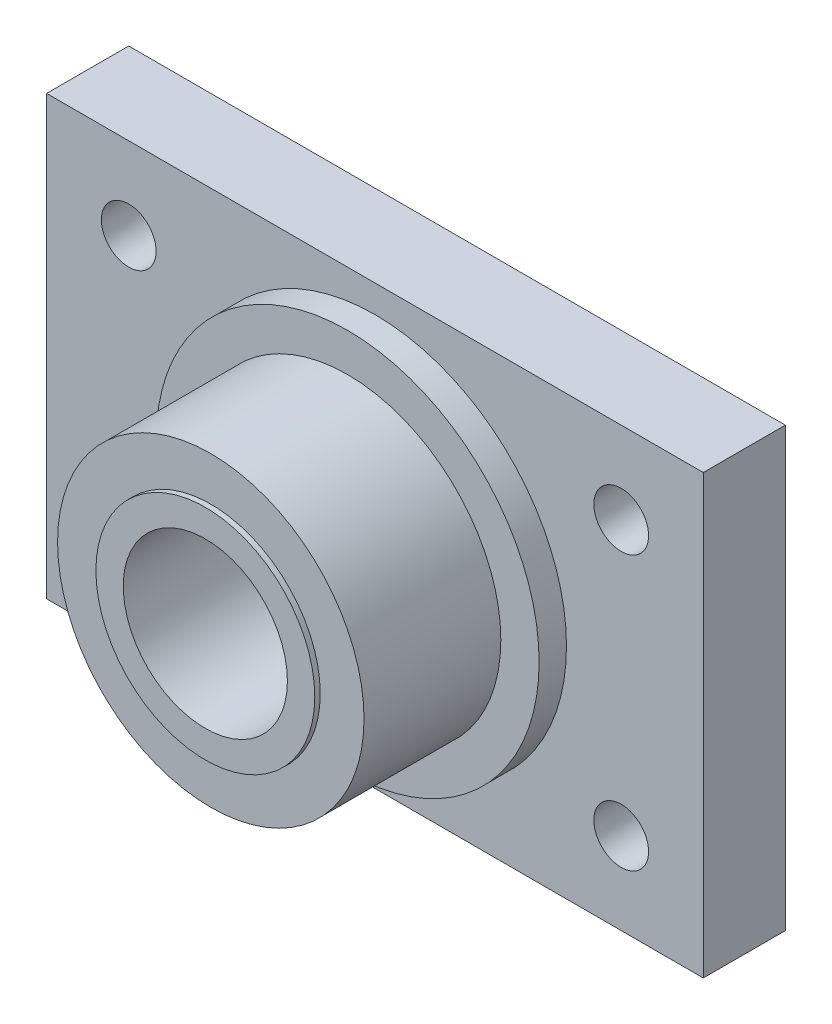
ISO-10303-21;
HEADER;
FILE_DESCRIPTION(('STEP AP214'),'2;1');
FILE_NAME('part.step','',(''),(''),'','','');
FILE_SCHEMA(('AUTOMOTIVE_DESIGN { 1 0 10303 214 1 1 1 1 }'));
ENDSEC;
DATA;
#1=APPLICATION_CONTEXT('core data for automotive mechanical design processes');
#2=APPLICATION_PROTOCOL_DEFINITION('international standard','automotive_design',2000,#1);
#3=PRODUCT_CONTEXT('',#1,'mechanical');
#4=PRODUCT('Part','Part','',(#3));
#5=PRODUCT_RELATED_PRODUCT_CATEGORY('part','',(#4));
#6=PRODUCT_DEFINITION_FORMATION('','',#4);
#7=PRODUCT_DEFINITION_CONTEXT('part definition',#1,'design');
#8=PRODUCT_DEFINITION('design','',#6,#7);
#9=PRODUCT_DEFINITION_SHAPE('','',#8);
#10=(LENGTH_UNIT() NAMED_UNIT(*) SI_UNIT(.MILLI.,.METRE.));
#11=(NAMED_UNIT(*) PLANE_ANGLE_UNIT() SI_UNIT($,.RADIAN.));
#12=(NAMED_UNIT(*) SI_UNIT($,.STERADIAN.) SOLID_ANGLE_UNIT());
#13=UNCERTAINTY_MEASURE_WITH_UNIT(LENGTH_MEASURE(1.E-05),#10,'distance_accuracy_value','');
#14=(GEOMETRIC_REPRESENTATION_CONTEXT(3) GLOBAL_UNCERTAINTY_ASSIGNED_CONTEXT((#13)) GLOBAL_UNIT_ASSIGNED_CONTEXT((#10,
#11,#12)) REPRESENTATION_CONTEXT('',''));
#15=CARTESIAN_POINT('',(0.,0.,0.));
#16=DIRECTION('',(0.,0.,1.));
#17=DIRECTION('',(1.,0.,0.));
#18=AXIS2_PLACEMENT_3D('',#15,#16,#17);
#19=CARTESIAN_POINT('',(0.,0.,15.));
#20=DIRECTION('',(0.,0.,1.));
#21=DIRECTION('',(1.,0.,0.));
#22=AXIS2_PLACEMENT_3D('',#19,#20,#21);
#23=PLANE('',#22);
#24=CARTESIAN_POINT('',(0.,0.,15.));
#25=DIRECTION('',(0.,0.,-1.));
#26=DIRECTION('',(1.,0.,0.));
#27=AXIS2_PLACEMENT_3D('',#24,#25,#26);
#28=CIRCLE('',#27,15.);
#29=CARTESIAN_POINT('',(15.,0.,15.));
#30=VERTEX_POINT('',#29);
#31=EDGE_CURVE('E25',#30,#30,#28,.T.);
#32=ORIENTED_EDGE('',*,*,#31,.F.);
#33=EDGE_LOOP('',(#32));
#34=FACE_BOUND('',#33,.T.);
#35=ADVANCED_FACE('F16',(#34),#23,.T.);
#36=CARTESIAN_POINT('',(0.,0.,0.));
#37=DIRECTION('',(0.,0.,-1.));
#38=DIRECTION('',(1.,0.,0.));
#39=AXIS2_PLACEMENT_3D('',#36,#37,#38);
#40=CYLINDRICAL_SURFACE('',#39,15.);
#41=ORIENTED_EDGE('',*,*,#31,.T.);
#42=DIRECTION('',(0.,0.,1.));
#43=VECTOR('',#42,1.);
#44=CARTESIAN_POINT('',(15.,0.,0.));
#45=LINE('',#44,#43);
#46=CARTESIAN_POINT('',(15.,0.,46.));
#47=VERTEX_POINT('',#46);
#48=EDGE_CURVE('E10',#30,#47,#45,.T.);
#49=ORIENTED_EDGE('',*,*,#48,.T.);
#50=CARTESIAN_POINT('',(0.,0.,46.));
#51=DIRECTION('',(0.,0.,-1.));
#52=DIRECTION('',(1.,0.,0.));
#53=AXIS2_PLACEMENT_3D('',#50,#51,#52);
#54=CIRCLE('',#53,15.);
#55=EDGE_CURVE('E19',#47,#47,#54,.T.);
#56=ORIENTED_EDGE('',*,*,#55,.F.);
#57=ORIENTED_EDGE('',*,*,#48,.F.);
#58=EDGE_LOOP('',(#41,#49,#56,#57));
#59=FACE_BOUND('',#58,.T.);
#60=ADVANCED_FACE('F274',(#59),#40,.F.);
#61=CARTESIAN_POINT('',(0.,0.,46.));
#62=DIRECTION('',(0.,0.,1.));
#63=DIRECTION('',(1.,0.,0.));
#64=AXIS2_PLACEMENT_3D('',#61,#62,#63);
#65=PLANE('',#64);
#66=ORIENTED_EDGE('',*,*,#55,.T.);
#67=EDGE_LOOP('',(#66));
#68=FACE_BOUND('',#67,.T.);
#69=CARTESIAN_POINT('',(0.,0.,46.));
#70=DIRECTION('',(0.,0.,1.));
#71=DIRECTION('',(1.,0.,0.));
#72=AXIS2_PLACEMENT_3D('',#69,#70,#71);
#73=CIRCLE('',#72,20.);
#74=CARTESIAN_POINT('',(20.,0.,46.));
#75=VERTEX_POINT('',#74);
#76=EDGE_CURVE('E228',#75,#75,#73,.T.);
#77=ORIENTED_EDGE('',*,*,#76,.T.);
#78=EDGE_LOOP('',(#77));
#79=FACE_BOUND('',#78,.T.);
#80=ADVANCED_FACE('F273',(#68,#79),#65,.T.);
#81=CARTESIAN_POINT('',(0.,0.,45.));
#82=DIRECTION('',(0.,0.,1.));
#83=DIRECTION('',(1.,0.,0.));
#84=AXIS2_PLACEMENT_3D('',#81,#82,#83);
#85=CYLINDRICAL_SURFACE('',#84,20.);
#86=CARTESIAN_POINT('',(0.,0.,45.));
#87=DIRECTION('',(0.,0.,1.));
#88=DIRECTION('',(1.,0.,0.));
#89=AXIS2_PLACEMENT_3D('',#86,#87,#88);
#90=CIRCLE('',#89,20.);
#91=CARTESIAN_POINT('',(20.,0.,45.));
#92=VERTEX_POINT('',#91);
#93=EDGE_CURVE('E229',#92,#92,#90,.T.);
#94=ORIENTED_EDGE('',*,*,#93,.T.);
#95=DIRECTION('',(0.,0.,1.));
#96=VECTOR('',#95,1.);
#97=CARTESIAN_POINT('',(20.,0.,45.));
#98=LINE('',#97,#96);
#99=EDGE_CURVE('E224',#92,#75,#98,.T.);
#100=ORIENTED_EDGE('',*,*,#99,.T.);
#101=ORIENTED_EDGE('',*,*,#76,.F.);
#102=ORIENTED_EDGE('',*,*,#99,.F.);
#103=EDGE_LOOP('',(#94,#100,#101,#102));
#104=FACE_BOUND('',#103,.T.);
#105=ADVANCED_FACE('F283',(#104),#85,.T.);
#106=CARTESIAN_POINT('',(0.,0.,45.));
#107=DIRECTION('',(0.,0.,1.));
#108=DIRECTION('',(1.,0.,0.));
#109=AXIS2_PLACEMENT_3D('',#106,#107,#108);
#110=PLANE('',#109);
#111=ORIENTED_EDGE('',*,*,#93,.F.);
#112=EDGE_LOOP('',(#111));
#113=FACE_BOUND('',#112,.T.);
#114=CARTESIAN_POINT('',(0.,0.,45.));
#115=DIRECTION('',(0.,0.,1.));
#116=DIRECTION('',(1.,0.,0.));
#117=AXIS2_PLACEMENT_3D('',#114,#115,#116);
#118=CIRCLE('',#117,28.);
#119=CARTESIAN_POINT('',(28.,0.,45.));
#120=VERTEX_POINT('',#119);
#121=EDGE_CURVE('E233',#120,#120,#118,.T.);
#122=ORIENTED_EDGE('',*,*,#121,.T.);
#123=EDGE_LOOP('',(#122));
#124=FACE_BOUND('',#123,.T.);
#125=ADVANCED_FACE('F309',(#113,#124),#110,.T.);
#126=CARTESIAN_POINT('',(0.,0.,20.));
#127=DIRECTION('',(0.,0.,1.));
#128=DIRECTION('',(1.,0.,0.));
#129=AXIS2_PLACEMENT_3D('',#126,#127,#128);
#130=CYLINDRICAL_SURFACE('',#129,28.);
#131=CARTESIAN_POINT('',(0.,0.,20.));
#132=DIRECTION('',(0.,0.,1.));
#133=DIRECTION('',(1.,0.,0.));
#134=AXIS2_PLACEMENT_3D('',#131,#132,#133);
#135=CIRCLE('',#134,28.);
#136=CARTESIAN_POINT('',(28.,0.,20.));
#137=VERTEX_POINT('',#136);
#138=EDGE_CURVE('E237',#137,#137,#135,.T.);
#139=ORIENTED_EDGE('',*,*,#138,.T.);
#140=DIRECTION('',(0.,0.,1.));
#141=VECTOR('',#140,1.);
#142=CARTESIAN_POINT('',(28.,0.,20.));
#143=LINE('',#142,#141);
#144=EDGE_CURVE('E236',#137,#120,#143,.T.);
#145=ORIENTED_EDGE('',*,*,#144,.T.);
#146=ORIENTED_EDGE('',*,*,#121,.F.);
#147=ORIENTED_EDGE('',*,*,#144,.F.);
#148=EDGE_LOOP('',(#139,#145,#146,#147));
#149=FACE_BOUND('',#148,.T.);
#150=ADVANCED_FACE('F319',(#149),#130,.T.);
#151=CARTESIAN_POINT('',(0.,0.,20.));
#152=DIRECTION('',(0.,0.,1.));
#153=DIRECTION('',(1.,0.,0.));
#154=AXIS2_PLACEMENT_3D('',#151,#152,#153);
#155=PLANE('',#154);
#156=ORIENTED_EDGE('',*,*,#138,.F.);
#157=EDGE_LOOP('',(#156));
#158=FACE_BOUND('',#157,.T.);
#159=CARTESIAN_POINT('',(0.,0.,20.));
#160=DIRECTION('',(0.,0.,1.));
#161=DIRECTION('',(1.,0.,0.));
#162=AXIS2_PLACEMENT_3D('',#159,#160,#161);
#163=CIRCLE('',#162,35.);
#164=CARTESIAN_POINT('',(35.,0.,20.));
#165=VERTEX_POINT('',#164);
#166=EDGE_CURVE('E241',#165,#165,#163,.T.);
#167=ORIENTED_EDGE('',*,*,#166,.T.);
#168=EDGE_LOOP('',(#167));
#169=FACE_BOUND('',#168,.T.);
#170=ADVANCED_FACE('F315',(#158,#169),#155,.T.);
#171=CARTESIAN_POINT('',(0.,0.,0.));
#172=DIRECTION('',(0.,0.,1.));
#173=DIRECTION('',(1.,0.,0.));
#174=AXIS2_PLACEMENT_3D('',#171,#172,#173);
#175=CYLINDRICAL_SURFACE('',#174,35.);
#176=CARTESIAN_POINT('',(0.,0.,15.));
#177=DIRECTION('',(0.,0.,1.));
#178=DIRECTION('',(1.,0.,0.));
#179=AXIS2_PLACEMENT_3D('',#176,#177,#178);
#180=CIRCLE('',#179,35.);
#181=CARTESIAN_POINT('',(35.,0.,15.));
#182=VERTEX_POINT('',#181);
#183=EDGE_CURVE('E197',#182,#182,#180,.T.);
#184=ORIENTED_EDGE('',*,*,#183,.T.);
#185=DIRECTION('',(0.,0.,1.));
#186=VECTOR('',#185,1.);
#187=CARTESIAN_POINT('',(35.,0.,0.));
#188=LINE('',#187,#186);
#189=EDGE_CURVE('E254',#182,#165,#188,.T.);
#190=ORIENTED_EDGE('',*,*,#189,.T.);
#191=ORIENTED_EDGE('',*,*,#166,.F.);
#192=ORIENTED_EDGE('',*,*,#189,.F.);
#193=EDGE_LOOP('',(#184,#190,#191,#192));
#194=FACE_BOUND('',#193,.T.);
#195=ADVANCED_FACE('F318',(#194),#175,.T.);
#196=CARTESIAN_POINT('',(0.,0.,15.));
#197=DIRECTION('',(0.,0.,1.));
#198=DIRECTION('',(1.,0.,0.));
#199=AXIS2_PLACEMENT_3D('',#196,#197,#198);
#200=PLANE('',#199);
#201=CARTESIAN_POINT('',(45.,25.,15.));
#202=DIRECTION('',(0.,0.,-1.));
#203=DIRECTION('',(1.,0.,0.));
#204=AXIS2_PLACEMENT_3D('',#201,#202,#203);
#205=CIRCLE('',#204,5.);
#206=CARTESIAN_POINT('',(50.,25.,15.));
#207=VERTEX_POINT('',#206);
#208=EDGE_CURVE('E195',#207,#207,#205,.T.);
#209=ORIENTED_EDGE('',*,*,#208,.T.);
#210=EDGE_LOOP('',(#209));
#211=FACE_BOUND('',#210,.T.);
#212=ORIENTED_EDGE('',*,*,#183,.F.);
#213=EDGE_LOOP('',(#212));
#214=FACE_BOUND('',#213,.T.);
#215=CARTESIAN_POINT('',(-45.,25.,15.));
#216=DIRECTION('',(0.,0.,-1.));
#217=DIRECTION('',(1.,0.,0.));
#218=AXIS2_PLACEMENT_3D('',#215,#216,#217);
#219=CIRCLE('',#218,5.);
#220=CARTESIAN_POINT('',(-40.,25.,15.));
#221=VERTEX_POINT('',#220);
#222=EDGE_CURVE('E245',#221,#221,#219,.T.);
#223=ORIENTED_EDGE('',*,*,#222,.T.);
#224=EDGE_LOOP('',(#223));
#225=FACE_BOUND('',#224,.T.);
#226=CARTESIAN_POINT('',(45.,-25.,15.));
#227=DIRECTION('',(0.,0.,-1.));
#228=DIRECTION('',(1.,0.,0.));
#229=AXIS2_PLACEMENT_3D('',#226,#227,#228);
#230=CIRCLE('',#229,5.);
#231=CARTESIAN_POINT('',(50.,-25.,15.));
#232=VERTEX_POINT('',#231);
#233=EDGE_CURVE('E214',#232,#232,#230,.T.);
#234=ORIENTED_EDGE('',*,*,#233,.T.);
#235=EDGE_LOOP('',(#234));
#236=FACE_BOUND('',#235,.T.);
#237=CARTESIAN_POINT('',(-45.,-25.,15.));
#238=DIRECTION('',(0.,0.,-1.));
#239=DIRECTION('',(1.,0.,0.));
#240=AXIS2_PLACEMENT_3D('',#237,#238,#239);
#241=CIRCLE('',#240,5.);
#242=CARTESIAN_POINT('',(-40.,-25.,15.));
#243=VERTEX_POINT('',#242);
#244=EDGE_CURVE('E215',#243,#243,#241,.T.);
#245=ORIENTED_EDGE('',*,*,#244,.T.);
#246=EDGE_LOOP('',(#245));
#247=FACE_BOUND('',#246,.T.);
#248=DIRECTION('',(1.,0.,0.));
#249=VECTOR('',#248,1.);
#250=CARTESIAN_POINT('',(-60.,-40.,15.));
#251=LINE('',#250,#249);
#252=CARTESIAN_POINT('',(-60.,-40.,15.));
#253=VERTEX_POINT('',#252);
#254=CARTESIAN_POINT('',(60.,-40.,15.));
#255=VERTEX_POINT('',#254);
#256=EDGE_CURVE('E140',#253,#255,#251,.T.);
#257=ORIENTED_EDGE('',*,*,#256,.T.);
#258=DIRECTION('',(0.,1.,0.));
#259=VECTOR('',#258,1.);
#260=CARTESIAN_POINT('',(60.,-40.,15.));
#261=LINE('',#260,#259);
#262=CARTESIAN_POINT('',(60.,40.,15.));
#263=VERTEX_POINT('',#262);
#264=EDGE_CURVE('E205',#255,#263,#261,.T.);
#265=ORIENTED_EDGE('',*,*,#264,.T.);
#266=DIRECTION('',(-1.,0.,0.));
#267=VECTOR('',#266,1.);
#268=CARTESIAN_POINT('',(60.,40.,15.));
#269=LINE('',#268,#267);
#270=CARTESIAN_POINT('',(-60.,40.,15.));
#271=VERTEX_POINT('',#270);
#272=EDGE_CURVE('E208',#263,#271,#269,.T.);
#273=ORIENTED_EDGE('',*,*,#272,.T.);
#274=DIRECTION('',(0.,-1.,0.));
#275=VECTOR('',#274,1.);
#276=CARTESIAN_POINT('',(-60.,40.,15.));
#277=LINE('',#276,#275);
#278=EDGE_CURVE('E144',#271,#253,#277,.T.);
#279=ORIENTED_EDGE('',*,*,#278,.T.);
#280=EDGE_LOOP('',(#257,#265,#273,#279));
#281=FACE_BOUND('',#280,.T.);
#282=ADVANCED_FACE('F327',(#211,#214,#225,#236,#247,#281),#200,.T.);
#283=CARTESIAN_POINT('',(45.,25.,0.));
#284=DIRECTION('',(0.,0.,-1.));
#285=DIRECTION('',(1.,0.,0.));
#286=AXIS2_PLACEMENT_3D('',#283,#284,#285);
#287=CYLINDRICAL_SURFACE('',#286,5.);
#288=CARTESIAN_POINT('',(45.,25.,0.));
#289=DIRECTION('',(0.,0.,1.));
#290=DIRECTION('',(1.,0.,0.));
#291=AXIS2_PLACEMENT_3D('',#288,#289,#290);
#292=CIRCLE('',#291,5.);
#293=CARTESIAN_POINT('',(50.,25.,0.));
#294=VERTEX_POINT('',#293);
#295=EDGE_CURVE('E168',#294,#294,#292,.T.);
#296=ORIENTED_EDGE('',*,*,#295,.F.);
#297=DIRECTION('',(0.,0.,1.));
#298=VECTOR('',#297,1.);
#299=CARTESIAN_POINT('',(50.,25.,0.));
#300=LINE('',#299,#298);
#301=EDGE_CURVE('E198',#294,#207,#300,.T.);
#302=ORIENTED_EDGE('',*,*,#301,.T.);
#303=ORIENTED_EDGE('',*,*,#208,.F.);
#304=ORIENTED_EDGE('',*,*,#301,.F.);
#305=EDGE_LOOP('',(#296,#302,#303,#304));
#306=FACE_BOUND('',#305,.T.);
#307=ADVANCED_FACE('F323',(#306),#287,.F.);
#308=CARTESIAN_POINT('',(-45.,25.,0.));
#309=DIRECTION('',(0.,0.,-1.));
#310=DIRECTION('',(1.,0.,0.));
#311=AXIS2_PLACEMENT_3D('',#308,#309,#310);
#312=CYLINDRICAL_SURFACE('',#311,5.);
#313=CARTESIAN_POINT('',(-45.,25.,0.));
#314=DIRECTION('',(0.,0.,1.));
#315=DIRECTION('',(1.,0.,0.));
#316=AXIS2_PLACEMENT_3D('',#313,#314,#315);
#317=CIRCLE('',#316,5.);
#318=CARTESIAN_POINT('',(-40.,25.,0.));
#319=VERTEX_POINT('',#318);
#320=EDGE_CURVE('E171',#319,#319,#317,.T.);
#321=ORIENTED_EDGE('',*,*,#320,.F.);
#322=DIRECTION('',(0.,0.,1.));
#323=VECTOR('',#322,1.);
#324=CARTESIAN_POINT('',(-40.,25.,0.));
#325=LINE('',#324,#323);
#326=EDGE_CURVE('E232',#319,#221,#325,.T.);
#327=ORIENTED_EDGE('',*,*,#326,.T.);
#328=ORIENTED_EDGE('',*,*,#222,.F.);
#329=ORIENTED_EDGE('',*,*,#326,.F.);
#330=EDGE_LOOP('',(#321,#327,#328,#329));
#331=FACE_BOUND('',#330,.T.);
#332=ADVANCED_FACE('F313',(#331),#312,.F.);
#333=CARTESIAN_POINT('',(45.,-25.,0.));
#334=DIRECTION('',(0.,0.,-1.));
#335=DIRECTION('',(1.,0.,0.));
#336=AXIS2_PLACEMENT_3D('',#333,#334,#335);
#337=CYLINDRICAL_SURFACE('',#336,5.);
#338=CARTESIAN_POINT('',(45.,-25.,0.));
#339=DIRECTION('',(0.,0.,1.));
#340=DIRECTION('',(1.,0.,0.));
#341=AXIS2_PLACEMENT_3D('',#338,#339,#340);
#342=CIRCLE('',#341,5.);
#343=CARTESIAN_POINT('',(50.,-25.,0.));
#344=VERTEX_POINT('',#343);
#345=EDGE_CURVE('E176',#344,#344,#342,.T.);
#346=ORIENTED_EDGE('',*,*,#345,.F.);
#347=DIRECTION('',(0.,0.,1.));
#348=VECTOR('',#347,1.);
#349=CARTESIAN_POINT('',(50.,-25.,0.));
#350=LINE('',#349,#348);
#351=EDGE_CURVE('E210',#344,#232,#350,.T.);
#352=ORIENTED_EDGE('',*,*,#351,.T.);
#353=ORIENTED_EDGE('',*,*,#233,.F.);
#354=ORIENTED_EDGE('',*,*,#351,.F.);
#355=EDGE_LOOP('',(#346,#352,#353,#354));
#356=FACE_BOUND('',#355,.T.);
#357=ADVANCED_FACE('F305',(#356),#337,.F.);
#358=CARTESIAN_POINT('',(-45.,-25.,0.));
#359=DIRECTION('',(0.,0.,-1.));
#360=DIRECTION('',(1.,0.,0.));
#361=AXIS2_PLACEMENT_3D('',#358,#359,#360);
#362=CYLINDRICAL_SURFACE('',#361,5.);
#363=CARTESIAN_POINT('',(-45.,-25.,0.));
#364=DIRECTION('',(0.,0.,1.));
#365=DIRECTION('',(1.,0.,0.));
#366=AXIS2_PLACEMENT_3D('',#363,#364,#365);
#367=CIRCLE('',#366,5.);
#368=CARTESIAN_POINT('',(-40.,-25.,0.));
#369=VERTEX_POINT('',#368);
#370=EDGE_CURVE('E179',#369,#369,#367,.T.);
#371=ORIENTED_EDGE('',*,*,#370,.F.);
#372=DIRECTION('',(0.,0.,1.));
#373=VECTOR('',#372,1.);
#374=CARTESIAN_POINT('',(-40.,-25.,0.));
#375=LINE('',#374,#373);
#376=EDGE_CURVE('E218',#369,#243,#375,.T.);
#377=ORIENTED_EDGE('',*,*,#376,.T.);
#378=ORIENTED_EDGE('',*,*,#244,.F.);
#379=ORIENTED_EDGE('',*,*,#376,.F.);
#380=EDGE_LOOP('',(#371,#377,#378,#379));
#381=FACE_BOUND('',#380,.T.);
#382=ADVANCED_FACE('F301',(#381),#362,.F.);
#383=CARTESIAN_POINT('',(60.,40.,0.));
#384=DIRECTION('',(0.,-1.,0.));
#385=DIRECTION('',(0.,0.,-1.));
#386=AXIS2_PLACEMENT_3D('',#383,#384,#385);
#387=PLANE('',#386);
#388=DIRECTION('',(-1.,0.,0.));
#389=VECTOR('',#388,1.);
#390=CARTESIAN_POINT('',(60.,40.,0.));
#391=LINE('',#390,#389);
#392=CARTESIAN_POINT('',(60.,40.,0.));
#393=VERTEX_POINT('',#392);
#394=CARTESIAN_POINT('',(-60.,40.,0.));
#395=VERTEX_POINT('',#394);
#396=EDGE_CURVE('E155',#393,#395,#391,.T.);
#397=ORIENTED_EDGE('',*,*,#396,.T.);
#398=DIRECTION('',(0.,0.,1.));
#399=VECTOR('',#398,1.);
#400=CARTESIAN_POINT('',(-60.,40.,0.));
#401=LINE('',#400,#399);
#402=EDGE_CURVE('E150',#395,#271,#401,.T.);
#403=ORIENTED_EDGE('',*,*,#402,.T.);
#404=ORIENTED_EDGE('',*,*,#272,.F.);
#405=DIRECTION('',(0.,0.,1.));
#406=VECTOR('',#405,1.);
#407=CARTESIAN_POINT('',(60.,40.,0.));
#408=LINE('',#407,#406);
#409=EDGE_CURVE('E190',#393,#263,#408,.T.);
#410=ORIENTED_EDGE('',*,*,#409,.F.);
#411=EDGE_LOOP('',(#397,#403,#404,#410));
#412=FACE_BOUND('',#411,.T.);
#413=ADVANCED_FACE('F295',(#412),#387,.F.);
#414=CARTESIAN_POINT('',(60.,-40.,0.));
#415=DIRECTION('',(-1.,0.,0.));
#416=DIRECTION('',(0.,0.,1.));
#417=AXIS2_PLACEMENT_3D('',#414,#415,#416);
#418=PLANE('',#417);
#419=DIRECTION('',(0.,1.,0.));
#420=VECTOR('',#419,1.);
#421=CARTESIAN_POINT('',(60.,-40.,0.));
#422=LINE('',#421,#420);
#423=CARTESIAN_POINT('',(60.,-40.,0.));
#424=VERTEX_POINT('',#423);
#425=EDGE_CURVE('E160',#424,#393,#422,.T.);
#426=ORIENTED_EDGE('',*,*,#425,.T.);
#427=ORIENTED_EDGE('',*,*,#409,.T.);
#428=ORIENTED_EDGE('',*,*,#264,.F.);
#429=DIRECTION('',(0.,0.,1.));
#430=VECTOR('',#429,1.);
#431=CARTESIAN_POINT('',(60.,-40.,0.));
#432=LINE('',#431,#430);
#433=EDGE_CURVE('E170',#424,#255,#432,.T.);
#434=ORIENTED_EDGE('',*,*,#433,.F.);
#435=EDGE_LOOP('',(#426,#427,#428,#434));
#436=FACE_BOUND('',#435,.T.);
#437=ADVANCED_FACE('F292',(#436),#418,.F.);
#438=CARTESIAN_POINT('',(-60.,40.,0.));
#439=DIRECTION('',(1.,0.,0.));
#440=DIRECTION('',(0.,1.,0.));
#441=AXIS2_PLACEMENT_3D('',#438,#439,#440);
#442=PLANE('',#441);
#443=DIRECTION('',(0.,-1.,0.));
#444=VECTOR('',#443,1.);
#445=CARTESIAN_POINT('',(-60.,40.,0.));
#446=LINE('',#445,#444);
#447=CARTESIAN_POINT('',(-60.,-40.,0.));
#448=VERTEX_POINT('',#447);
#449=EDGE_CURVE('E147',#395,#448,#446,.T.);
#450=ORIENTED_EDGE('',*,*,#449,.T.);
#451=DIRECTION('',(0.,0.,1.));
#452=VECTOR('',#451,1.);
#453=CARTESIAN_POINT('',(-60.,-40.,0.));
#454=LINE('',#453,#452);
#455=EDGE_CURVE('E133',#448,#253,#454,.T.);
#456=ORIENTED_EDGE('',*,*,#455,.T.);
#457=ORIENTED_EDGE('',*,*,#278,.F.);
#458=ORIENTED_EDGE('',*,*,#402,.F.);
#459=EDGE_LOOP('',(#450,#456,#457,#458));
#460=FACE_BOUND('',#459,.T.);
#461=ADVANCED_FACE('F148',(#460),#442,.F.);
#462=CARTESIAN_POINT('',(-60.,-40.,0.));
#463=DIRECTION('',(0.,1.,0.));
#464=DIRECTION('',(1.,0.,0.));
#465=AXIS2_PLACEMENT_3D('',#462,#463,#464);
#466=PLANE('',#465);
#467=DIRECTION('',(1.,0.,0.));
#468=VECTOR('',#467,1.);
#469=CARTESIAN_POINT('',(-60.,-40.,0.));
#470=LINE('',#469,#468);
#471=EDGE_CURVE('E138',#448,#424,#470,.T.);
#472=ORIENTED_EDGE('',*,*,#471,.T.);
#473=ORIENTED_EDGE('',*,*,#433,.T.);
#474=ORIENTED_EDGE('',*,*,#256,.F.);
#475=ORIENTED_EDGE('',*,*,#455,.F.);
#476=EDGE_LOOP('',(#472,#473,#474,#475));
#477=FACE_BOUND('',#476,.T.);
#478=ADVANCED_FACE('F135',(#477),#466,.F.);
#479=CARTESIAN_POINT('',(0.,0.,0.));
#480=DIRECTION('',(0.,0.,1.));
#481=DIRECTION('',(1.,0.,0.));
#482=AXIS2_PLACEMENT_3D('',#479,#480,#481);
#483=PLANE('',#482);
#484=ORIENTED_EDGE('',*,*,#295,.T.);
#485=EDGE_LOOP('',(#484));
#486=FACE_BOUND('',#485,.T.);
#487=ORIENTED_EDGE('',*,*,#320,.T.);
#488=EDGE_LOOP('',(#487));
#489=FACE_BOUND('',#488,.T.);
#490=ORIENTED_EDGE('',*,*,#345,.T.);
#491=EDGE_LOOP('',(#490));
#492=FACE_BOUND('',#491,.T.);
#493=ORIENTED_EDGE('',*,*,#370,.T.);
#494=EDGE_LOOP('',(#493));
#495=FACE_BOUND('',#494,.T.);
#496=ORIENTED_EDGE('',*,*,#471,.F.);
#497=ORIENTED_EDGE('',*,*,#449,.F.);
#498=ORIENTED_EDGE('',*,*,#396,.F.);
#499=ORIENTED_EDGE('',*,*,#425,.F.);
#500=EDGE_LOOP('',(#496,#497,#498,#499));
#501=FACE_BOUND('',#500,.T.);
#502=ADVANCED_FACE('F158',(#486,#489,#492,#495,#501),#483,.F.);
#503=CLOSED_SHELL('',(#35,#60,#80,#105,#125,#150,#170,#195,#282,#307,#332,#357,#382,#413,#437,
#461,#478,#502));
#504=MANIFOLD_SOLID_BREP('B1',#503);
#505=ADVANCED_BREP_SHAPE_REPRESENTATION('',(#18,#504),#14);
#506=SHAPE_DEFINITION_REPRESENTATION(#9,#505);
ENDSEC;
END-ISO-10303-21;
